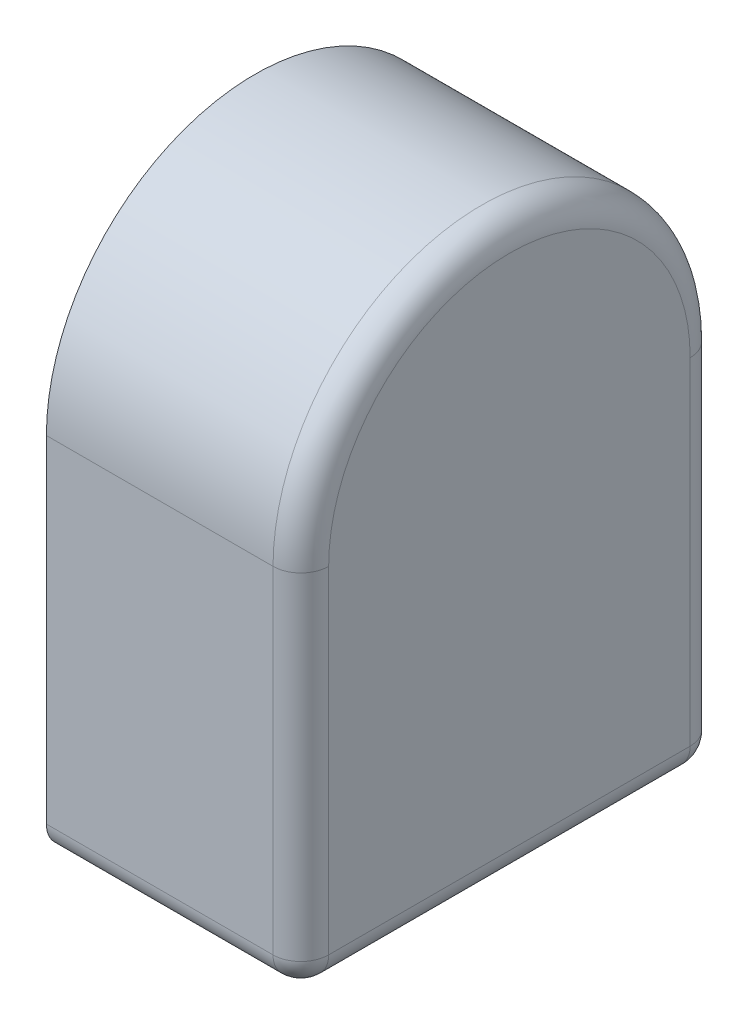
ISO-10303-21;
HEADER;
FILE_DESCRIPTION(('STEP AP214'),'2;1');
FILE_NAME('part.step','',(''),(''),'','','');
FILE_SCHEMA(('AUTOMOTIVE_DESIGN { 1 0 10303 214 1 1 1 1 }'));
ENDSEC;
DATA;
#1=APPLICATION_CONTEXT('core data for automotive mechanical design processes');
#2=APPLICATION_PROTOCOL_DEFINITION('international standard','automotive_design',2000,#1);
#3=PRODUCT_CONTEXT('',#1,'mechanical');
#4=PRODUCT('Part','Part','',(#3));
#5=PRODUCT_RELATED_PRODUCT_CATEGORY('part','',(#4));
#6=PRODUCT_DEFINITION_FORMATION('','',#4);
#7=PRODUCT_DEFINITION_CONTEXT('part definition',#1,'design');
#8=PRODUCT_DEFINITION('design','',#6,#7);
#9=PRODUCT_DEFINITION_SHAPE('','',#8);
#10=(LENGTH_UNIT() NAMED_UNIT(*) SI_UNIT(.MILLI.,.METRE.));
#11=(NAMED_UNIT(*) PLANE_ANGLE_UNIT() SI_UNIT($,.RADIAN.));
#12=(NAMED_UNIT(*) SI_UNIT($,.STERADIAN.) SOLID_ANGLE_UNIT());
#13=UNCERTAINTY_MEASURE_WITH_UNIT(LENGTH_MEASURE(1.E-05),#10,'distance_accuracy_value','');
#14=(GEOMETRIC_REPRESENTATION_CONTEXT(3) GLOBAL_UNCERTAINTY_ASSIGNED_CONTEXT((#13)) GLOBAL_UNIT_ASSIGNED_CONTEXT((#10,
#11,#12)) REPRESENTATION_CONTEXT('',''));
#15=CARTESIAN_POINT('',(0.,0.,0.));
#16=DIRECTION('',(0.,0.,1.));
#17=DIRECTION('',(1.,0.,0.));
#18=AXIS2_PLACEMENT_3D('',#15,#16,#17);
#19=CARTESIAN_POINT('',(18.3,0.,0.));
#20=DIRECTION('',(0.,0.,-1.));
#21=DIRECTION('',(-1.,0.,0.));
#22=AXIS2_PLACEMENT_3D('',#19,#20,#21);
#23=PLANE('',#22);
#24=DIRECTION('',(-1.,0.,0.));
#25=VECTOR('',#24,1.);
#26=CARTESIAN_POINT('',(18.3,2.,0.));
#27=LINE('',#26,#25);
#28=CARTESIAN_POINT('',(0.,2.,0.));
#29=VERTEX_POINT('',#28);
#30=CARTESIAN_POINT('',(16.3,2.,0.));
#31=VERTEX_POINT('',#30);
#32=EDGE_CURVE('E48',#29,#31,#27,.F.);
#33=ORIENTED_EDGE('',*,*,#32,.T.);
#34=DIRECTION('',(0.,-1.,0.));
#35=VECTOR('',#34,1.);
#36=CARTESIAN_POINT('',(16.3,0.,0.));
#37=LINE('',#36,#35);
#38=CARTESIAN_POINT('',(16.3,26.2,0.));
#39=VERTEX_POINT('',#38);
#40=EDGE_CURVE('E144',#31,#39,#37,.F.);
#41=ORIENTED_EDGE('',*,*,#40,.T.);
#42=DIRECTION('',(-1.,0.,0.));
#43=VECTOR('',#42,1.);
#44=CARTESIAN_POINT('',(18.3,26.2,0.));
#45=LINE('',#44,#43);
#46=CARTESIAN_POINT('',(0.,26.2,0.));
#47=VERTEX_POINT('',#46);
#48=EDGE_CURVE('E117',#39,#47,#45,.T.);
#49=ORIENTED_EDGE('',*,*,#48,.T.);
#50=DIRECTION('',(0.,-1.,0.));
#51=VECTOR('',#50,1.);
#52=CARTESIAN_POINT('',(0.,0.,0.));
#53=LINE('',#52,#51);
#54=EDGE_CURVE('E120',#47,#29,#53,.T.);
#55=ORIENTED_EDGE('',*,*,#54,.T.);
#56=EDGE_LOOP('',(#33,#41,#49,#55));
#57=FACE_BOUND('',#56,.T.);
#58=ADVANCED_FACE('F34',(#57),#23,.F.);
#59=CARTESIAN_POINT('',(18.3,0.,0.));
#60=DIRECTION('',(0.,1.,0.));
#61=DIRECTION('',(0.,0.,1.));
#62=AXIS2_PLACEMENT_3D('',#59,#60,#61);
#63=PLANE('',#62);
#64=DIRECTION('',(0.,0.,-1.));
#65=VECTOR('',#64,1.);
#66=CARTESIAN_POINT('',(0.,0.,0.));
#67=LINE('',#66,#65);
#68=CARTESIAN_POINT('',(0.,0.,-2.));
#69=VERTEX_POINT('',#68);
#70=CARTESIAN_POINT('',(0.,0.,-28.));
#71=VERTEX_POINT('',#70);
#72=EDGE_CURVE('E107',#69,#71,#67,.T.);
#73=ORIENTED_EDGE('',*,*,#72,.T.);
#74=DIRECTION('',(-1.,0.,0.));
#75=VECTOR('',#74,1.);
#76=CARTESIAN_POINT('',(18.3,0.,-28.));
#77=LINE('',#76,#75);
#78=CARTESIAN_POINT('',(16.3,0.,-28.));
#79=VERTEX_POINT('',#78);
#80=EDGE_CURVE('E141',#71,#79,#77,.F.);
#81=ORIENTED_EDGE('',*,*,#80,.T.);
#82=DIRECTION('',(0.,0.,-1.));
#83=VECTOR('',#82,1.);
#84=CARTESIAN_POINT('',(16.3,0.,0.));
#85=LINE('',#84,#83);
#86=CARTESIAN_POINT('',(16.3,0.,-2.));
#87=VERTEX_POINT('',#86);
#88=EDGE_CURVE('E139',#79,#87,#85,.F.);
#89=ORIENTED_EDGE('',*,*,#88,.T.);
#90=DIRECTION('',(-1.,0.,0.));
#91=VECTOR('',#90,1.);
#92=CARTESIAN_POINT('',(18.3,0.,-2.));
#93=LINE('',#92,#91);
#94=EDGE_CURVE('E137',#87,#69,#93,.T.);
#95=ORIENTED_EDGE('',*,*,#94,.T.);
#96=EDGE_LOOP('',(#73,#81,#89,#95));
#97=FACE_BOUND('',#96,.T.);
#98=ADVANCED_FACE('F187',(#97),#63,.F.);
#99=CARTESIAN_POINT('',(18.3,0.,-30.));
#100=DIRECTION('',(0.,0.,1.));
#101=DIRECTION('',(1.,0.,0.));
#102=AXIS2_PLACEMENT_3D('',#99,#100,#101);
#103=PLANE('',#102);
#104=DIRECTION('',(-1.,0.,0.));
#105=VECTOR('',#104,1.);
#106=CARTESIAN_POINT('',(18.3,26.2,-30.));
#107=LINE('',#106,#105);
#108=CARTESIAN_POINT('',(16.3,26.2,-30.));
#109=VERTEX_POINT('',#108);
#110=CARTESIAN_POINT('',(0.,26.2,-30.));
#111=VERTEX_POINT('',#110);
#112=EDGE_CURVE('E101',#109,#111,#107,.T.);
#113=ORIENTED_EDGE('',*,*,#112,.F.);
#114=DIRECTION('',(0.,1.,0.));
#115=VECTOR('',#114,1.);
#116=CARTESIAN_POINT('',(16.3,0.,-30.));
#117=LINE('',#116,#115);
#118=CARTESIAN_POINT('',(16.3,2.,-30.));
#119=VERTEX_POINT('',#118);
#120=EDGE_CURVE('E135',#109,#119,#117,.F.);
#121=ORIENTED_EDGE('',*,*,#120,.T.);
#122=DIRECTION('',(-1.,0.,0.));
#123=VECTOR('',#122,1.);
#124=CARTESIAN_POINT('',(18.3,2.,-30.));
#125=LINE('',#124,#123);
#126=CARTESIAN_POINT('',(0.,2.,-30.));
#127=VERTEX_POINT('',#126);
#128=EDGE_CURVE('E103',#119,#127,#125,.T.);
#129=ORIENTED_EDGE('',*,*,#128,.T.);
#130=DIRECTION('',(0.,1.,0.));
#131=VECTOR('',#130,1.);
#132=CARTESIAN_POINT('',(0.,0.,-30.));
#133=LINE('',#132,#131);
#134=EDGE_CURVE('E98',#127,#111,#133,.T.);
#135=ORIENTED_EDGE('',*,*,#134,.T.);
#136=EDGE_LOOP('',(#113,#121,#129,#135));
#137=FACE_BOUND('',#136,.T.);
#138=ADVANCED_FACE('F100',(#137),#103,.F.);
#139=CARTESIAN_POINT('',(18.3,26.2,-15.));
#140=DIRECTION('',(-1.,0.,0.));
#141=DIRECTION('',(0.,0.,1.));
#142=AXIS2_PLACEMENT_3D('',#139,#140,#141);
#143=CYLINDRICAL_SURFACE('',#142,15.);
#144=ORIENTED_EDGE('',*,*,#48,.F.);
#145=CARTESIAN_POINT('',(16.3,26.2,-15.));
#146=DIRECTION('',(-1.,0.,0.));
#147=DIRECTION('',(0.,0.,1.));
#148=AXIS2_PLACEMENT_3D('',#145,#146,#147);
#149=CIRCLE('',#148,15.);
#150=EDGE_CURVE('E115',#39,#109,#149,.T.);
#151=ORIENTED_EDGE('',*,*,#150,.T.);
#152=ORIENTED_EDGE('',*,*,#112,.T.);
#153=CARTESIAN_POINT('',(0.,26.2,-15.));
#154=DIRECTION('',(1.,0.,0.));
#155=DIRECTION('',(0.,0.,1.));
#156=AXIS2_PLACEMENT_3D('',#153,#154,#155);
#157=CIRCLE('',#156,15.);
#158=EDGE_CURVE('E106',#111,#47,#157,.T.);
#159=ORIENTED_EDGE('',*,*,#158,.T.);
#160=EDGE_LOOP('',(#144,#151,#152,#159));
#161=FACE_BOUND('',#160,.T.);
#162=ADVANCED_FACE('F113',(#161),#143,.T.);
#163=CARTESIAN_POINT('',(18.3,26.2,-15.));
#164=DIRECTION('',(-1.,0.,0.));
#165=DIRECTION('',(0.,0.,1.));
#166=AXIS2_PLACEMENT_3D('',#163,#164,#165);
#167=PLANE('',#166);
#168=DIRECTION('',(0.,1.,0.));
#169=VECTOR('',#168,1.);
#170=CARTESIAN_POINT('',(18.3,26.2,-28.));
#171=LINE('',#170,#169);
#172=CARTESIAN_POINT('',(18.3,2.,-28.));
#173=VERTEX_POINT('',#172);
#174=CARTESIAN_POINT('',(18.3,26.2,-28.));
#175=VERTEX_POINT('',#174);
#176=EDGE_CURVE('E128',#173,#175,#171,.T.);
#177=ORIENTED_EDGE('',*,*,#176,.T.);
#178=CARTESIAN_POINT('',(18.3,26.2,-15.));
#179=DIRECTION('',(-1.,0.,0.));
#180=DIRECTION('',(0.,0.,1.));
#181=AXIS2_PLACEMENT_3D('',#178,#179,#180);
#182=CIRCLE('',#181,13.);
#183=CARTESIAN_POINT('',(18.3,26.2,-2.));
#184=VERTEX_POINT('',#183);
#185=EDGE_CURVE('E130',#175,#184,#182,.F.);
#186=ORIENTED_EDGE('',*,*,#185,.T.);
#187=DIRECTION('',(0.,-1.,0.));
#188=VECTOR('',#187,1.);
#189=CARTESIAN_POINT('',(18.3,26.2,-2.));
#190=LINE('',#189,#188);
#191=CARTESIAN_POINT('',(18.3,2.,-2.));
#192=VERTEX_POINT('',#191);
#193=EDGE_CURVE('E116',#184,#192,#190,.T.);
#194=ORIENTED_EDGE('',*,*,#193,.T.);
#195=DIRECTION('',(0.,0.,-1.));
#196=VECTOR('',#195,1.);
#197=CARTESIAN_POINT('',(18.3,2.,-15.));
#198=LINE('',#197,#196);
#199=EDGE_CURVE('E126',#192,#173,#198,.T.);
#200=ORIENTED_EDGE('',*,*,#199,.T.);
#201=EDGE_LOOP('',(#177,#186,#194,#200));
#202=FACE_BOUND('',#201,.T.);
#203=ADVANCED_FACE('F228',(#202),#167,.F.);
#204=CARTESIAN_POINT('',(0.,26.2,-15.));
#205=DIRECTION('',(-1.,0.,0.));
#206=DIRECTION('',(0.,0.,1.));
#207=AXIS2_PLACEMENT_3D('',#204,#205,#206);
#208=PLANE('',#207);
#209=CARTESIAN_POINT('',(0.,26.2,-15.));
#210=DIRECTION('',(-1.,0.,0.));
#211=DIRECTION('',(0.,0.,1.));
#212=AXIS2_PLACEMENT_3D('',#209,#210,#211);
#213=CIRCLE('',#212,3.01);
#214=CARTESIAN_POINT('',(0.,26.2,-11.99));
#215=VERTEX_POINT('',#214);
#216=EDGE_CURVE('E178',#215,#215,#213,.T.);
#217=ORIENTED_EDGE('',*,*,#216,.F.);
#218=EDGE_LOOP('',(#217));
#219=FACE_BOUND('',#218,.T.);
#220=ORIENTED_EDGE('',*,*,#134,.F.);
#221=CARTESIAN_POINT('',(0.,2.,-28.));
#222=DIRECTION('',(-1.,0.,0.));
#223=DIRECTION('',(0.,0.,1.));
#224=AXIS2_PLACEMENT_3D('',#221,#222,#223);
#225=CIRCLE('',#224,2.);
#226=EDGE_CURVE('E11',#127,#71,#225,.T.);
#227=ORIENTED_EDGE('',*,*,#226,.T.);
#228=ORIENTED_EDGE('',*,*,#72,.F.);
#229=CARTESIAN_POINT('',(0.,2.,-2.));
#230=DIRECTION('',(-1.,0.,0.));
#231=DIRECTION('',(0.,0.,1.));
#232=AXIS2_PLACEMENT_3D('',#229,#230,#231);
#233=CIRCLE('',#232,2.);
#234=EDGE_CURVE('E41',#69,#29,#233,.T.);
#235=ORIENTED_EDGE('',*,*,#234,.T.);
#236=ORIENTED_EDGE('',*,*,#54,.F.);
#237=ORIENTED_EDGE('',*,*,#158,.F.);
#238=EDGE_LOOP('',(#220,#227,#228,#235,#236,#237));
#239=FACE_BOUND('',#238,.T.);
#240=ADVANCED_FACE('F119',(#219,#239),#208,.T.);
#241=CARTESIAN_POINT('',(15.5,26.2,-15.));
#242=DIRECTION('',(-1.,0.,0.));
#243=DIRECTION('',(0.,0.,1.));
#244=AXIS2_PLACEMENT_3D('',#241,#242,#243);
#245=CYLINDRICAL_SURFACE('',#244,3.01);
#246=CARTESIAN_POINT('',(15.5,26.2,-15.));
#247=DIRECTION('',(-1.,0.,0.));
#248=DIRECTION('',(0.,0.,1.));
#249=AXIS2_PLACEMENT_3D('',#246,#247,#248);
#250=CIRCLE('',#249,3.01);
#251=CARTESIAN_POINT('',(15.5,26.2,-11.99));
#252=VERTEX_POINT('',#251);
#253=EDGE_CURVE('E181',#252,#252,#250,.T.);
#254=ORIENTED_EDGE('',*,*,#253,.F.);
#255=EDGE_LOOP('',(#254));
#256=FACE_BOUND('',#255,.T.);
#257=ORIENTED_EDGE('',*,*,#216,.T.);
#258=EDGE_LOOP('',(#257));
#259=FACE_BOUND('',#258,.T.);
#260=ADVANCED_FACE('F234',(#256,#259),#245,.F.);
#261=CARTESIAN_POINT('',(15.5,26.2,-15.));
#262=DIRECTION('',(-1.,0.,0.));
#263=DIRECTION('',(0.,0.,1.));
#264=AXIS2_PLACEMENT_3D('',#261,#262,#263);
#265=PLANE('',#264);
#266=ORIENTED_EDGE('',*,*,#253,.T.);
#267=EDGE_LOOP('',(#266));
#268=FACE_BOUND('',#267,.T.);
#269=ADVANCED_FACE('F238',(#268),#265,.T.);
#270=CARTESIAN_POINT('',(18.3,2.,-28.));
#271=DIRECTION('',(-1.,0.,0.));
#272=DIRECTION('',(0.,0.,1.));
#273=AXIS2_PLACEMENT_3D('',#270,#271,#272);
#274=CYLINDRICAL_SURFACE('',#273,2.);
#275=ORIENTED_EDGE('',*,*,#226,.F.);
#276=ORIENTED_EDGE('',*,*,#128,.F.);
#277=CARTESIAN_POINT('',(16.3,2.,-28.));
#278=DIRECTION('',(1.,0.,0.));
#279=DIRECTION('',(0.,0.,-1.));
#280=AXIS2_PLACEMENT_3D('',#277,#278,#279);
#281=CIRCLE('',#280,2.);
#282=EDGE_CURVE('E175',#79,#119,#281,.T.);
#283=ORIENTED_EDGE('',*,*,#282,.F.);
#284=ORIENTED_EDGE('',*,*,#80,.F.);
#285=EDGE_LOOP('',(#275,#276,#283,#284));
#286=FACE_BOUND('',#285,.T.);
#287=ADVANCED_FACE('F192',(#286),#274,.T.);
#288=CARTESIAN_POINT('',(16.3,2.,-15.));
#289=DIRECTION('',(0.,0.,-1.));
#290=DIRECTION('',(-1.,0.,0.));
#291=AXIS2_PLACEMENT_3D('',#288,#289,#290);
#292=CYLINDRICAL_SURFACE('',#291,2.);
#293=CARTESIAN_POINT('',(16.3,2.,-2.));
#294=DIRECTION('',(0.,0.,1.));
#295=DIRECTION('',(1.,0.,0.));
#296=AXIS2_PLACEMENT_3D('',#293,#294,#295);
#297=CIRCLE('',#296,2.);
#298=EDGE_CURVE('E169',#87,#192,#297,.T.);
#299=ORIENTED_EDGE('',*,*,#298,.F.);
#300=ORIENTED_EDGE('',*,*,#88,.F.);
#301=CARTESIAN_POINT('',(16.3,2.,-28.));
#302=DIRECTION('',(0.,0.,-1.));
#303=DIRECTION('',(-1.,0.,0.));
#304=AXIS2_PLACEMENT_3D('',#301,#302,#303);
#305=CIRCLE('',#304,2.);
#306=EDGE_CURVE('E172',#173,#79,#305,.T.);
#307=ORIENTED_EDGE('',*,*,#306,.F.);
#308=ORIENTED_EDGE('',*,*,#199,.F.);
#309=EDGE_LOOP('',(#299,#300,#307,#308));
#310=FACE_BOUND('',#309,.T.);
#311=ADVANCED_FACE('F201',(#310),#292,.T.);
#312=CARTESIAN_POINT('',(18.3,2.,-2.));
#313=DIRECTION('',(-1.,0.,0.));
#314=DIRECTION('',(0.,0.,1.));
#315=AXIS2_PLACEMENT_3D('',#312,#313,#314);
#316=CYLINDRICAL_SURFACE('',#315,2.);
#317=ORIENTED_EDGE('',*,*,#234,.F.);
#318=ORIENTED_EDGE('',*,*,#94,.F.);
#319=CARTESIAN_POINT('',(16.3,2.,-2.));
#320=DIRECTION('',(1.,0.,0.));
#321=DIRECTION('',(0.,0.,-1.));
#322=AXIS2_PLACEMENT_3D('',#319,#320,#321);
#323=CIRCLE('',#322,2.);
#324=EDGE_CURVE('E166',#31,#87,#323,.T.);
#325=ORIENTED_EDGE('',*,*,#324,.F.);
#326=ORIENTED_EDGE('',*,*,#32,.F.);
#327=EDGE_LOOP('',(#317,#318,#325,#326));
#328=FACE_BOUND('',#327,.T.);
#329=ADVANCED_FACE('F203',(#328),#316,.T.);
#330=CARTESIAN_POINT('',(16.3,2.,-28.));
#331=DIRECTION('',(0.,0.,1.));
#332=DIRECTION('',(1.,0.,0.));
#333=AXIS2_PLACEMENT_3D('',#330,#331,#332);
#334=SPHERICAL_SURFACE('',#333,2.);
#335=ORIENTED_EDGE('',*,*,#306,.T.);
#336=ORIENTED_EDGE('',*,*,#282,.T.);
#337=CARTESIAN_POINT('',(16.3,2.,-28.));
#338=DIRECTION('',(0.,-1.,0.));
#339=DIRECTION('',(1.,0.,0.));
#340=AXIS2_PLACEMENT_3D('',#337,#338,#339);
#341=CIRCLE('',#340,2.);
#342=EDGE_CURVE('E163',#173,#119,#341,.F.);
#343=ORIENTED_EDGE('',*,*,#342,.F.);
#344=EDGE_LOOP('',(#335,#336,#343));
#345=FACE_BOUND('',#344,.T.);
#346=ADVANCED_FACE('F196',(#345),#334,.T.);
#347=CARTESIAN_POINT('',(16.3,2.,-2.));
#348=DIRECTION('',(0.,0.,1.));
#349=DIRECTION('',(1.,0.,0.));
#350=AXIS2_PLACEMENT_3D('',#347,#348,#349);
#351=SPHERICAL_SURFACE('',#350,2.);
#352=ORIENTED_EDGE('',*,*,#324,.T.);
#353=ORIENTED_EDGE('',*,*,#298,.T.);
#354=CARTESIAN_POINT('',(16.3,2.,-2.));
#355=DIRECTION('',(0.,-1.,0.));
#356=DIRECTION('',(0.,0.,-1.));
#357=AXIS2_PLACEMENT_3D('',#354,#355,#356);
#358=CIRCLE('',#357,2.);
#359=EDGE_CURVE('E159',#31,#192,#358,.F.);
#360=ORIENTED_EDGE('',*,*,#359,.F.);
#361=EDGE_LOOP('',(#352,#353,#360));
#362=FACE_BOUND('',#361,.T.);
#363=ADVANCED_FACE('F206',(#362),#351,.T.);
#364=CARTESIAN_POINT('',(16.3,26.2,-28.));
#365=DIRECTION('',(0.,1.,0.));
#366=DIRECTION('',(0.,0.,1.));
#367=AXIS2_PLACEMENT_3D('',#364,#365,#366);
#368=CYLINDRICAL_SURFACE('',#367,2.);
#369=ORIENTED_EDGE('',*,*,#342,.T.);
#370=ORIENTED_EDGE('',*,*,#120,.F.);
#371=CARTESIAN_POINT('',(16.3,26.2,-28.));
#372=DIRECTION('',(0.,1.,0.));
#373=DIRECTION('',(0.,0.,1.));
#374=AXIS2_PLACEMENT_3D('',#371,#372,#373);
#375=CIRCLE('',#374,2.);
#376=EDGE_CURVE('E155',#175,#109,#375,.T.);
#377=ORIENTED_EDGE('',*,*,#376,.F.);
#378=ORIENTED_EDGE('',*,*,#176,.F.);
#379=EDGE_LOOP('',(#369,#370,#377,#378));
#380=FACE_BOUND('',#379,.T.);
#381=ADVANCED_FACE('F208',(#380),#368,.T.);
#382=CARTESIAN_POINT('',(16.3,26.2,-2.));
#383=DIRECTION('',(0.,-1.,0.));
#384=DIRECTION('',(0.,0.,-1.));
#385=AXIS2_PLACEMENT_3D('',#382,#383,#384);
#386=CYLINDRICAL_SURFACE('',#385,2.);
#387=ORIENTED_EDGE('',*,*,#359,.T.);
#388=ORIENTED_EDGE('',*,*,#193,.F.);
#389=CARTESIAN_POINT('',(16.3,26.2,-2.));
#390=DIRECTION('',(0.,1.,0.));
#391=DIRECTION('',(0.,0.,1.));
#392=AXIS2_PLACEMENT_3D('',#389,#390,#391);
#393=CIRCLE('',#392,2.);
#394=EDGE_CURVE('E152',#39,#184,#393,.T.);
#395=ORIENTED_EDGE('',*,*,#394,.F.);
#396=ORIENTED_EDGE('',*,*,#40,.F.);
#397=EDGE_LOOP('',(#387,#388,#395,#396));
#398=FACE_BOUND('',#397,.T.);
#399=ADVANCED_FACE('F157',(#398),#386,.T.);
#400=CARTESIAN_POINT('',(16.3,26.2,-15.));
#401=DIRECTION('',(-1.,0.,0.));
#402=DIRECTION('',(0.,0.,1.));
#403=AXIS2_PLACEMENT_3D('',#400,#401,#402);
#404=TOROIDAL_SURFACE('',#403,13.,2.);
#405=ORIENTED_EDGE('',*,*,#376,.T.);
#406=ORIENTED_EDGE('',*,*,#150,.F.);
#407=ORIENTED_EDGE('',*,*,#394,.T.);
#408=ORIENTED_EDGE('',*,*,#185,.F.);
#409=EDGE_LOOP('',(#405,#406,#407,#408));
#410=FACE_BOUND('',#409,.T.);
#411=ADVANCED_FACE('F150',(#410),#404,.T.);
#412=CLOSED_SHELL('',(#58,#98,#138,#162,#203,#240,#260,#269,#287,#311,#329,#346,#363,#381,#399,#411));
#413=MANIFOLD_SOLID_BREP('B2',#412);
#414=ADVANCED_BREP_SHAPE_REPRESENTATION('',(#18,#413),#14);
#415=SHAPE_DEFINITION_REPRESENTATION(#9,#414);
ENDSEC;
END-ISO-10303-21;
